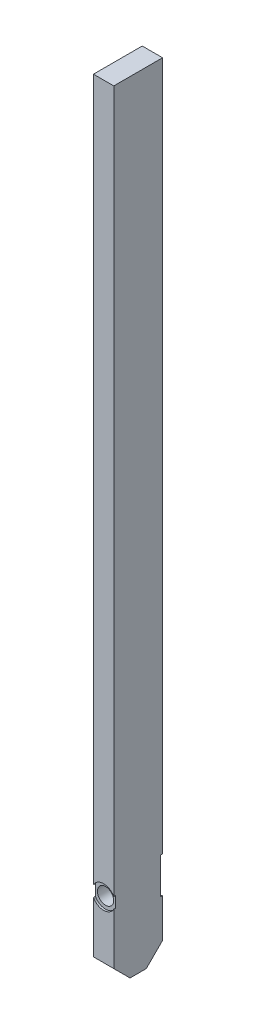
ISO-10303-21;
HEADER;
FILE_DESCRIPTION(('STEP AP214'),'2;1');
FILE_NAME('part.step','',(''),(''),'','','');
FILE_SCHEMA(('AUTOMOTIVE_DESIGN { 1 0 10303 214 1 1 1 1 }'));
ENDSEC;
DATA;
#1=APPLICATION_CONTEXT('core data for automotive mechanical design processes');
#2=APPLICATION_PROTOCOL_DEFINITION('international standard','automotive_design',2000,#1);
#3=PRODUCT_CONTEXT('',#1,'mechanical');
#4=PRODUCT('Part','Part','',(#3));
#5=PRODUCT_RELATED_PRODUCT_CATEGORY('part','',(#4));
#6=PRODUCT_DEFINITION_FORMATION('','',#4);
#7=PRODUCT_DEFINITION_CONTEXT('part definition',#1,'design');
#8=PRODUCT_DEFINITION('design','',#6,#7);
#9=PRODUCT_DEFINITION_SHAPE('','',#8);
#10=(LENGTH_UNIT() NAMED_UNIT(*) SI_UNIT(.MILLI.,.METRE.));
#11=(NAMED_UNIT(*) PLANE_ANGLE_UNIT() SI_UNIT($,.RADIAN.));
#12=(NAMED_UNIT(*) SI_UNIT($,.STERADIAN.) SOLID_ANGLE_UNIT());
#13=UNCERTAINTY_MEASURE_WITH_UNIT(LENGTH_MEASURE(1.E-05),#10,'distance_accuracy_value','');
#14=(GEOMETRIC_REPRESENTATION_CONTEXT(3) GLOBAL_UNCERTAINTY_ASSIGNED_CONTEXT((#13)) GLOBAL_UNIT_ASSIGNED_CONTEXT((#10,
#11,#12)) REPRESENTATION_CONTEXT('',''));
#15=CARTESIAN_POINT('',(0.,0.,0.));
#16=DIRECTION('',(0.,0.,1.));
#17=DIRECTION('',(1.,0.,0.));
#18=AXIS2_PLACEMENT_3D('',#15,#16,#17);
#19=CARTESIAN_POINT('',(15.875,304.8,19.05));
#20=DIRECTION('',(0.,0.,-1.));
#21=DIRECTION('',(0.,1.,0.));
#22=AXIS2_PLACEMENT_3D('',#19,#20,#21);
#23=PLANE('',#22);
#24=CARTESIAN_POINT('',(7.93749999999999,-247.65,19.05));
#25=DIRECTION('',(0.,0.,1.));
#26=DIRECTION('',(1.,0.,0.));
#27=AXIS2_PLACEMENT_3D('',#24,#25,#26);
#28=CIRCLE('',#27,9.01700000000001);
#29=CARTESIAN_POINT('',(15.875,-243.371871583274,19.05));
#30=VERTEX_POINT('',#29);
#31=CARTESIAN_POINT('',(0.,-243.371871583274,19.05));
#32=VERTEX_POINT('',#31);
#33=EDGE_CURVE('E150',#30,#32,#28,.T.);
#34=ORIENTED_EDGE('',*,*,#33,.F.);
#35=DIRECTION('',(0.,-1.,0.));
#36=VECTOR('',#35,1.);
#37=CARTESIAN_POINT('',(15.875,304.8,19.05));
#38=LINE('',#37,#36);
#39=CARTESIAN_POINT('',(15.875,304.8,19.05));
#40=VERTEX_POINT('',#39);
#41=EDGE_CURVE('E156',#40,#30,#38,.T.);
#42=ORIENTED_EDGE('',*,*,#41,.F.);
#43=DIRECTION('',(-1.,0.,0.));
#44=VECTOR('',#43,1.);
#45=CARTESIAN_POINT('',(15.875,304.8,19.05));
#46=LINE('',#45,#44);
#47=CARTESIAN_POINT('',(0.,304.8,19.05));
#48=VERTEX_POINT('',#47);
#49=EDGE_CURVE('E175',#40,#48,#46,.T.);
#50=ORIENTED_EDGE('',*,*,#49,.T.);
#51=DIRECTION('',(0.,-1.,0.));
#52=VECTOR('',#51,1.);
#53=CARTESIAN_POINT('',(0.,304.8,19.05));
#54=LINE('',#53,#52);
#55=EDGE_CURVE('E159',#48,#32,#54,.T.);
#56=ORIENTED_EDGE('',*,*,#55,.T.);
#57=EDGE_LOOP('',(#34,#42,#50,#56));
#58=FACE_BOUND('',#57,.T.);
#59=ADVANCED_FACE('F43',(#58),#23,.F.);
#60=CARTESIAN_POINT('',(0.,-251.928128416726,19.05));
#61=VERTEX_POINT('',#60);
#62=CARTESIAN_POINT('',(15.875,-251.928128416726,19.05));
#63=VERTEX_POINT('',#62);
#64=EDGE_CURVE('E162',#61,#63,#28,.T.);
#65=ORIENTED_EDGE('',*,*,#64,.F.);
#66=CARTESIAN_POINT('',(0.,-292.1,19.05));
#67=VERTEX_POINT('',#66);
#68=EDGE_CURVE('E182',#61,#67,#54,.T.);
#69=ORIENTED_EDGE('',*,*,#68,.T.);
#70=DIRECTION('',(1.,0.,0.));
#71=VECTOR('',#70,1.);
#72=CARTESIAN_POINT('',(15.875,-292.1,19.05));
#73=LINE('',#72,#71);
#74=CARTESIAN_POINT('',(15.875,-292.1,19.05));
#75=VERTEX_POINT('',#74);
#76=EDGE_CURVE('E211',#67,#75,#73,.T.);
#77=ORIENTED_EDGE('',*,*,#76,.T.);
#78=EDGE_CURVE('E169',#63,#75,#38,.T.);
#79=ORIENTED_EDGE('',*,*,#78,.F.);
#80=EDGE_LOOP('',(#65,#69,#77,#79));
#81=FACE_BOUND('',#80,.T.);
#82=ADVANCED_FACE('F241',(#81),#23,.F.);
#83=CARTESIAN_POINT('',(7.93749999999999,-247.65,-0.381000000000006));
#84=DIRECTION('',(0.,0.,1.));
#85=DIRECTION('',(1.,0.,0.));
#86=AXIS2_PLACEMENT_3D('',#83,#84,#85);
#87=CYLINDRICAL_SURFACE('',#86,6.35);
#88=CARTESIAN_POINT('',(7.93749999999999,-247.65,-0.381000000000006));
#89=DIRECTION('',(0.,0.,1.));
#90=DIRECTION('',(1.,0.,0.));
#91=AXIS2_PLACEMENT_3D('',#88,#89,#90);
#92=CIRCLE('',#91,6.35);
#93=CARTESIAN_POINT('',(14.2875,-247.65,-0.381000000000006));
#94=VERTEX_POINT('',#93);
#95=EDGE_CURVE('E200',#94,#94,#92,.T.);
#96=CARTESIAN_POINT('',(7.93749999999999,-247.65,17.526));
#97=DIRECTION('',(0.,0.,1.));
#98=DIRECTION('',(1.,0.,0.));
#99=AXIS2_PLACEMENT_3D('',#96,#97,#98);
#100=CIRCLE('',#99,6.35);
#101=CARTESIAN_POINT('',(14.2875,-247.65,17.526));
#102=VERTEX_POINT('',#101);
#103=EDGE_CURVE('E224',#102,#102,#100,.F.);
#104=CARTESIAN_POINT('',(14.2875,-247.65,-0.381000000000006));
#105=CARTESIAN_POINT('',(14.2875,-247.65,-0.194468750000007));
#106=CARTESIAN_POINT('',(14.2875,-247.65,-0.0079375000000065));
#107=CARTESIAN_POINT('',(14.2875,-247.65,0.365124999999994));
#108=CARTESIAN_POINT('',(14.2875,-247.65,0.551656249999993));
#109=CARTESIAN_POINT('',(14.2875,-247.65,0.924718749999993));
#110=CARTESIAN_POINT('',(14.2875,-247.65,1.11124999999999));
#111=CARTESIAN_POINT('',(14.2875,-247.65,1.48431249999999));
#112=CARTESIAN_POINT('',(14.2875,-247.65,1.67084374999999));
#113=CARTESIAN_POINT('',(14.2875,-247.65,2.04390624999999));
#114=CARTESIAN_POINT('',(14.2875,-247.65,2.23043749999999));
#115=CARTESIAN_POINT('',(14.2875,-247.65,2.60349999999999));
#116=CARTESIAN_POINT('',(14.2875,-247.65,2.79003124999999));
#117=CARTESIAN_POINT('',(14.2875,-247.65,3.16309374999999));
#118=CARTESIAN_POINT('',(14.2875,-247.65,3.34962499999999));
#119=CARTESIAN_POINT('',(14.2875,-247.65,3.72268749999999));
#120=CARTESIAN_POINT('',(14.2875,-247.65,3.90921874999999));
#121=CARTESIAN_POINT('',(14.2875,-247.65,4.28228124999999));
#122=CARTESIAN_POINT('',(14.2875,-247.65,4.46881249999999));
#123=CARTESIAN_POINT('',(14.2875,-247.65,4.84187499999999));
#124=CARTESIAN_POINT('',(14.2875,-247.65,5.02840624999999));
#125=CARTESIAN_POINT('',(14.2875,-247.65,5.40146874999999));
#126=CARTESIAN_POINT('',(14.2875,-247.65,5.58799999999999));
#127=CARTESIAN_POINT('',(14.2875,-247.65,5.96106249999999));
#128=CARTESIAN_POINT('',(14.2875,-247.65,6.14759374999999));
#129=CARTESIAN_POINT('',(14.2875,-247.65,6.52065624999999));
#130=CARTESIAN_POINT('',(14.2875,-247.65,6.70718749999999));
#131=CARTESIAN_POINT('',(14.2875,-247.65,7.08024999999999));
#132=CARTESIAN_POINT('',(14.2875,-247.65,7.26678124999999));
#133=CARTESIAN_POINT('',(14.2875,-247.65,7.63984374999999));
#134=CARTESIAN_POINT('',(14.2875,-247.65,7.82637499999999));
#135=CARTESIAN_POINT('',(14.2875,-247.65,8.19943749999999));
#136=CARTESIAN_POINT('',(14.2875,-247.65,8.38596874999999));
#137=CARTESIAN_POINT('',(14.2875,-247.65,8.75903124999999));
#138=CARTESIAN_POINT('',(14.2875,-247.65,8.94556249999999));
#139=CARTESIAN_POINT('',(14.2875,-247.65,9.31862499999999));
#140=CARTESIAN_POINT('',(14.2875,-247.65,9.50515624999999));
#141=CARTESIAN_POINT('',(14.2875,-247.65,9.87821874999999));
#142=CARTESIAN_POINT('',(14.2875,-247.65,10.06475));
#143=CARTESIAN_POINT('',(14.2875,-247.65,10.4378125));
#144=CARTESIAN_POINT('',(14.2875,-247.65,10.62434375));
#145=CARTESIAN_POINT('',(14.2875,-247.65,10.99740625));
#146=CARTESIAN_POINT('',(14.2875,-247.65,11.1839375));
#147=CARTESIAN_POINT('',(14.2875,-247.65,11.557));
#148=CARTESIAN_POINT('',(14.2875,-247.65,11.74353125));
#149=CARTESIAN_POINT('',(14.2875,-247.65,12.11659375));
#150=CARTESIAN_POINT('',(14.2875,-247.65,12.303125));
#151=CARTESIAN_POINT('',(14.2875,-247.65,12.6761875));
#152=CARTESIAN_POINT('',(14.2875,-247.65,12.86271875));
#153=CARTESIAN_POINT('',(14.2875,-247.65,13.23578125));
#154=CARTESIAN_POINT('',(14.2875,-247.65,13.4223125));
#155=CARTESIAN_POINT('',(14.2875,-247.65,13.795375));
#156=CARTESIAN_POINT('',(14.2875,-247.65,13.98190625));
#157=CARTESIAN_POINT('',(14.2875,-247.65,14.35496875));
#158=CARTESIAN_POINT('',(14.2875,-247.65,14.5415));
#159=CARTESIAN_POINT('',(14.2875,-247.65,14.9145625));
#160=CARTESIAN_POINT('',(14.2875,-247.65,15.10109375));
#161=CARTESIAN_POINT('',(14.2875,-247.65,15.47415625));
#162=CARTESIAN_POINT('',(14.2875,-247.65,15.6606875));
#163=CARTESIAN_POINT('',(14.2875,-247.65,16.03375));
#164=CARTESIAN_POINT('',(14.2875,-247.65,16.22028125));
#165=CARTESIAN_POINT('',(14.2875,-247.65,16.59334375));
#166=CARTESIAN_POINT('',(14.2875,-247.65,16.779875));
#167=CARTESIAN_POINT('',(14.2875,-247.65,17.1529375));
#168=CARTESIAN_POINT('',(14.2875,-247.65,17.33946875));
#169=CARTESIAN_POINT('',(14.2875,-247.65,17.526));
#170=B_SPLINE_CURVE_WITH_KNOTS('',3,(#104,#105,#106,#107,#108,#109,#110,#111,#112,#113,#114,
#115,#116,#117,#118,#119,#120,#121,#122,#123,#124,#125,#126,#127,#128,#129,#130,#131,#132,#133,
#134,#135,#136,#137,#138,#139,#140,#141,#142,#143,#144,#145,#146,#147,#148,#149,#150,#151,#152,
#153,#154,#155,#156,#157,#158,#159,#160,#161,#162,#163,#164,#165,#166,#167,#168,#169),
.UNSPECIFIED.,.F.,.F.,(4,2,2,2,2,2,2,2,2,2,2,2,2,2,2,2,2,2,2,2,2,2,2,2,2,2,2,2,2,2,2,2,4),(0.,
0.55959375,1.1191875,1.67878125,2.238375,2.79796875,3.3575625,3.91715625,4.47675,5.03634375,
5.5959375,6.15553125,6.715125,7.27471875,7.8343125,8.39390625,8.9535,9.51309375,10.0726875,
10.63228125,11.191875,11.75146875,12.3110625,12.87065625,13.43025,13.98984375,14.5494375,
15.10903125,15.668625,16.22821875,16.7878125,17.34740625,17.907),.UNSPECIFIED.);
#171=EDGE_CURVE('BSEAM325',#94,#102,#170,.T.);
#172=ORIENTED_EDGE('',*,*,#95,.F.);
#173=ORIENTED_EDGE('',*,*,#103,.F.);
#174=ORIENTED_EDGE('',*,*,#171,.T.);
#175=ORIENTED_EDGE('',*,*,#171,.F.);
#176=EDGE_LOOP('',(#172,#174,#173,#175));
#177=FACE_BOUND('',#176,.T.);
#178=ADVANCED_FACE('F325',(#177),#87,.F.);
#179=CARTESIAN_POINT('',(7.93749999999999,-247.65,-19.05));
#180=DIRECTION('',(0.,0.,1.));
#181=DIRECTION('',(1.,0.,0.));
#182=AXIS2_PLACEMENT_3D('',#179,#180,#181);
#183=CYLINDRICAL_SURFACE('',#182,4.7625);
#184=CARTESIAN_POINT('',(7.93749999999999,-247.65,-0.381000000000006));
#185=DIRECTION('',(0.,0.,1.));
#186=DIRECTION('',(1.,0.,0.));
#187=AXIS2_PLACEMENT_3D('',#184,#185,#186);
#188=CIRCLE('',#187,4.7625);
#189=CARTESIAN_POINT('',(12.7,-247.65,-0.381000000000006));
#190=VERTEX_POINT('',#189);
#191=EDGE_CURVE('E191',#190,#190,#188,.F.);
#192=ORIENTED_EDGE('',*,*,#191,.F.);
#193=EDGE_LOOP('',(#192));
#194=FACE_BOUND('',#193,.T.);
#195=CARTESIAN_POINT('',(7.93749999999999,-247.65,-17.272));
#196=DIRECTION('',(0.,0.,-1.));
#197=DIRECTION('',(0.,1.,0.));
#198=AXIS2_PLACEMENT_3D('',#195,#196,#197);
#199=CIRCLE('',#198,4.7625);
#200=CARTESIAN_POINT('',(7.93749999999999,-242.8875,-17.272));
#201=VERTEX_POINT('',#200);
#202=EDGE_CURVE('E263',#201,#201,#199,.F.);
#203=ORIENTED_EDGE('',*,*,#202,.F.);
#204=EDGE_LOOP('',(#203));
#205=FACE_BOUND('',#204,.T.);
#206=ADVANCED_FACE('F327',(#194,#205),#183,.F.);
#207=CARTESIAN_POINT('',(15.875,304.8,-19.05));
#208=DIRECTION('',(0.,0.,1.));
#209=DIRECTION('',(0.,-1.,0.));
#210=AXIS2_PLACEMENT_3D('',#207,#208,#209);
#211=PLANE('',#210);
#212=CARTESIAN_POINT('',(7.93749999999999,-247.65,-19.05));
#213=DIRECTION('',(0.,0.,-1.));
#214=DIRECTION('',(0.,1.,0.));
#215=AXIS2_PLACEMENT_3D('',#212,#213,#214);
#216=CIRCLE('',#215,16.1925);
#217=CARTESIAN_POINT('',(15.875,-261.763580339517,-19.05));
#218=VERTEX_POINT('',#217);
#219=CARTESIAN_POINT('',(0.,-261.763580339517,-19.05));
#220=VERTEX_POINT('',#219);
#221=EDGE_CURVE('E257',#218,#220,#216,.T.);
#222=ORIENTED_EDGE('',*,*,#221,.F.);
#223=DIRECTION('',(0.,1.,0.));
#224=VECTOR('',#223,1.);
#225=CARTESIAN_POINT('',(15.875,304.8,-19.05));
#226=LINE('',#225,#224);
#227=CARTESIAN_POINT('',(15.875,-292.1,-19.05));
#228=VERTEX_POINT('',#227);
#229=EDGE_CURVE('E267',#228,#218,#226,.T.);
#230=ORIENTED_EDGE('',*,*,#229,.F.);
#231=DIRECTION('',(-1.,0.,0.));
#232=VECTOR('',#231,1.);
#233=CARTESIAN_POINT('',(15.875,-292.1,-19.05));
#234=LINE('',#233,#232);
#235=CARTESIAN_POINT('',(0.,-292.1,-19.05));
#236=VERTEX_POINT('',#235);
#237=EDGE_CURVE('E194',#228,#236,#234,.T.);
#238=ORIENTED_EDGE('',*,*,#237,.T.);
#239=DIRECTION('',(0.,1.,0.));
#240=VECTOR('',#239,1.);
#241=CARTESIAN_POINT('',(0.,304.8,-19.05));
#242=LINE('',#241,#240);
#243=EDGE_CURVE('E180',#236,#220,#242,.T.);
#244=ORIENTED_EDGE('',*,*,#243,.T.);
#245=EDGE_LOOP('',(#222,#230,#238,#244));
#246=FACE_BOUND('',#245,.T.);
#247=ADVANCED_FACE('F291',(#246),#211,.F.);
#248=CARTESIAN_POINT('',(0.,-233.536419660483,-19.05));
#249=VERTEX_POINT('',#248);
#250=CARTESIAN_POINT('',(15.875,-233.536419660483,-19.05));
#251=VERTEX_POINT('',#250);
#252=EDGE_CURVE('E153',#249,#251,#216,.T.);
#253=ORIENTED_EDGE('',*,*,#252,.F.);
#254=CARTESIAN_POINT('',(0.,304.8,-19.05));
#255=VERTEX_POINT('',#254);
#256=EDGE_CURVE('E181',#249,#255,#242,.T.);
#257=ORIENTED_EDGE('',*,*,#256,.T.);
#258=DIRECTION('',(-1.,0.,0.));
#259=VECTOR('',#258,1.);
#260=CARTESIAN_POINT('',(15.875,304.8,-19.05));
#261=LINE('',#260,#259);
#262=CARTESIAN_POINT('',(15.875,304.8,-19.05));
#263=VERTEX_POINT('',#262);
#264=EDGE_CURVE('E188',#263,#255,#261,.T.);
#265=ORIENTED_EDGE('',*,*,#264,.F.);
#266=EDGE_CURVE('E189',#251,#263,#226,.T.);
#267=ORIENTED_EDGE('',*,*,#266,.F.);
#268=EDGE_LOOP('',(#253,#257,#265,#267));
#269=FACE_BOUND('',#268,.T.);
#270=ADVANCED_FACE('F278',(#269),#211,.F.);
#271=CARTESIAN_POINT('',(15.875,304.8,19.05));
#272=DIRECTION('',(0.,-1.,0.));
#273=DIRECTION('',(0.,0.,-1.));
#274=AXIS2_PLACEMENT_3D('',#271,#272,#273);
#275=PLANE('',#274);
#276=DIRECTION('',(0.,0.,1.));
#277=VECTOR('',#276,1.);
#278=CARTESIAN_POINT('',(0.,304.8,19.05));
#279=LINE('',#278,#277);
#280=EDGE_CURVE('E179',#255,#48,#279,.T.);
#281=ORIENTED_EDGE('',*,*,#280,.T.);
#282=ORIENTED_EDGE('',*,*,#49,.F.);
#283=DIRECTION('',(0.,0.,1.));
#284=VECTOR('',#283,1.);
#285=CARTESIAN_POINT('',(15.875,304.8,19.05));
#286=LINE('',#285,#284);
#287=EDGE_CURVE('E168',#263,#40,#286,.T.);
#288=ORIENTED_EDGE('',*,*,#287,.F.);
#289=ORIENTED_EDGE('',*,*,#264,.T.);
#290=EDGE_LOOP('',(#281,#282,#288,#289));
#291=FACE_BOUND('',#290,.T.);
#292=ADVANCED_FACE('F276',(#291),#275,.F.);
#293=CARTESIAN_POINT('',(15.875,-304.8,19.05));
#294=DIRECTION('',(0.,1.,0.));
#295=DIRECTION('',(0.,0.,1.));
#296=AXIS2_PLACEMENT_3D('',#293,#294,#295);
#297=PLANE('',#296);
#298=DIRECTION('',(0.,0.,-1.));
#299=VECTOR('',#298,1.);
#300=CARTESIAN_POINT('',(0.,-304.8,19.05));
#301=LINE('',#300,#299);
#302=CARTESIAN_POINT('',(0.,-304.8,6.34999999999992));
#303=VERTEX_POINT('',#302);
#304=CARTESIAN_POINT('',(0.,-304.8,-6.35000000000005));
#305=VERTEX_POINT('',#304);
#306=EDGE_CURVE('E184',#303,#305,#301,.T.);
#307=ORIENTED_EDGE('',*,*,#306,.T.);
#308=DIRECTION('',(1.,0.,0.));
#309=VECTOR('',#308,1.);
#310=CARTESIAN_POINT('',(15.875,-304.8,-6.35000000000006));
#311=LINE('',#310,#309);
#312=CARTESIAN_POINT('',(15.875,-304.8,-6.35000000000005));
#313=VERTEX_POINT('',#312);
#314=EDGE_CURVE('E206',#305,#313,#311,.T.);
#315=ORIENTED_EDGE('',*,*,#314,.T.);
#316=DIRECTION('',(0.,0.,-1.));
#317=VECTOR('',#316,1.);
#318=CARTESIAN_POINT('',(15.875,-304.8,19.05));
#319=LINE('',#318,#317);
#320=CARTESIAN_POINT('',(15.875,-304.8,6.34999999999992));
#321=VERTEX_POINT('',#320);
#322=EDGE_CURVE('E166',#321,#313,#319,.T.);
#323=ORIENTED_EDGE('',*,*,#322,.F.);
#324=DIRECTION('',(-1.,0.,0.));
#325=VECTOR('',#324,1.);
#326=CARTESIAN_POINT('',(15.875,-304.8,6.34999999999991));
#327=LINE('',#326,#325);
#328=EDGE_CURVE('E204',#321,#303,#327,.T.);
#329=ORIENTED_EDGE('',*,*,#328,.T.);
#330=EDGE_LOOP('',(#307,#315,#323,#329));
#331=FACE_BOUND('',#330,.T.);
#332=ADVANCED_FACE('F297',(#331),#297,.F.);
#333=CARTESIAN_POINT('',(15.875,0.,0.));
#334=DIRECTION('',(1.,0.,0.));
#335=DIRECTION('',(0.,0.,-1.));
#336=AXIS2_PLACEMENT_3D('',#333,#334,#335);
#337=PLANE('',#336);
#338=DIRECTION('',(0.,0.,1.));
#339=VECTOR('',#338,1.);
#340=CARTESIAN_POINT('',(15.875,-243.371871583274,17.526));
#341=LINE('',#340,#339);
#342=CARTESIAN_POINT('',(15.875,-243.371871583274,17.526));
#343=VERTEX_POINT('',#342);
#344=EDGE_CURVE('E144',#343,#30,#341,.T.);
#345=ORIENTED_EDGE('',*,*,#344,.F.);
#346=DIRECTION('',(0.,-1.,0.));
#347=VECTOR('',#346,1.);
#348=CARTESIAN_POINT('',(15.875,0.,17.526));
#349=LINE('',#348,#347);
#350=CARTESIAN_POINT('',(15.875,-251.928128416726,17.526));
#351=VERTEX_POINT('',#350);
#352=EDGE_CURVE('E249',#343,#351,#349,.T.);
#353=ORIENTED_EDGE('',*,*,#352,.T.);
#354=DIRECTION('',(0.,0.,1.));
#355=VECTOR('',#354,1.);
#356=CARTESIAN_POINT('',(15.875,-251.928128416726,17.526));
#357=LINE('',#356,#355);
#358=EDGE_CURVE('E155',#63,#351,#357,.F.);
#359=ORIENTED_EDGE('',*,*,#358,.F.);
#360=ORIENTED_EDGE('',*,*,#78,.T.);
#361=DIRECTION('',(0.,0.707106781186551,0.707106781186544));
#362=VECTOR('',#361,1.);
#363=CARTESIAN_POINT('',(15.875,-155.574999999999,155.575));
#364=LINE('',#363,#362);
#365=EDGE_CURVE('E208',#75,#321,#364,.F.);
#366=ORIENTED_EDGE('',*,*,#365,.T.);
#367=ORIENTED_EDGE('',*,*,#322,.T.);
#368=DIRECTION('',(0.,-0.707106781186543,0.707106781186552));
#369=VECTOR('',#368,1.);
#370=CARTESIAN_POINT('',(15.875,-155.575000000002,-155.575));
#371=LINE('',#370,#369);
#372=EDGE_CURVE('E215',#313,#228,#371,.F.);
#373=ORIENTED_EDGE('',*,*,#372,.T.);
#374=ORIENTED_EDGE('',*,*,#229,.T.);
#375=DIRECTION('',(0.,0.,-1.));
#376=VECTOR('',#375,1.);
#377=CARTESIAN_POINT('',(15.875,-261.763580339517,-17.272));
#378=LINE('',#377,#376);
#379=CARTESIAN_POINT('',(15.875,-261.763580339517,-17.272));
#380=VERTEX_POINT('',#379);
#381=EDGE_CURVE('E268',#380,#218,#378,.T.);
#382=ORIENTED_EDGE('',*,*,#381,.F.);
#383=DIRECTION('',(0.,1.,0.));
#384=VECTOR('',#383,1.);
#385=CARTESIAN_POINT('',(15.875,0.,-17.272));
#386=LINE('',#385,#384);
#387=CARTESIAN_POINT('',(15.875,-233.536419660483,-17.272));
#388=VERTEX_POINT('',#387);
#389=EDGE_CURVE('E259',#380,#388,#386,.T.);
#390=ORIENTED_EDGE('',*,*,#389,.T.);
#391=DIRECTION('',(0.,0.,-1.));
#392=VECTOR('',#391,1.);
#393=CARTESIAN_POINT('',(15.875,-233.536419660483,-17.272));
#394=LINE('',#393,#392);
#395=EDGE_CURVE('E262',#251,#388,#394,.F.);
#396=ORIENTED_EDGE('',*,*,#395,.F.);
#397=ORIENTED_EDGE('',*,*,#266,.T.);
#398=ORIENTED_EDGE('',*,*,#287,.T.);
#399=ORIENTED_EDGE('',*,*,#41,.T.);
#400=EDGE_LOOP('',(#345,#353,#359,#360,#366,#367,#373,#374,#382,#390,#396,#397,#398,#399));
#401=FACE_BOUND('',#400,.T.);
#402=ADVANCED_FACE('F165',(#401),#337,.T.);
#403=CARTESIAN_POINT('',(0.,0.,0.));
#404=DIRECTION('',(1.,0.,0.));
#405=DIRECTION('',(0.,0.,-1.));
#406=AXIS2_PLACEMENT_3D('',#403,#404,#405);
#407=PLANE('',#406);
#408=DIRECTION('',(0.,-1.,0.));
#409=VECTOR('',#408,1.);
#410=CARTESIAN_POINT('',(0.,0.,17.526));
#411=LINE('',#410,#409);
#412=CARTESIAN_POINT('',(0.,-243.371871583274,17.526));
#413=VERTEX_POINT('',#412);
#414=CARTESIAN_POINT('',(0.,-251.928128416726,17.526));
#415=VERTEX_POINT('',#414);
#416=EDGE_CURVE('E227',#413,#415,#411,.T.);
#417=ORIENTED_EDGE('',*,*,#416,.F.);
#418=DIRECTION('',(0.,0.,1.));
#419=VECTOR('',#418,1.);
#420=CARTESIAN_POINT('',(0.,-243.371871583274,17.526));
#421=LINE('',#420,#419);
#422=EDGE_CURVE('E11',#413,#32,#421,.T.);
#423=ORIENTED_EDGE('',*,*,#422,.T.);
#424=ORIENTED_EDGE('',*,*,#55,.F.);
#425=ORIENTED_EDGE('',*,*,#280,.F.);
#426=ORIENTED_EDGE('',*,*,#256,.F.);
#427=DIRECTION('',(0.,0.,-1.));
#428=VECTOR('',#427,1.);
#429=CARTESIAN_POINT('',(0.,-233.536419660483,-17.272));
#430=LINE('',#429,#428);
#431=CARTESIAN_POINT('',(0.,-233.536419660483,-17.272));
#432=VERTEX_POINT('',#431);
#433=EDGE_CURVE('E217',#249,#432,#430,.F.);
#434=ORIENTED_EDGE('',*,*,#433,.T.);
#435=DIRECTION('',(0.,1.,0.));
#436=VECTOR('',#435,1.);
#437=CARTESIAN_POINT('',(0.,0.,-17.272));
#438=LINE('',#437,#436);
#439=CARTESIAN_POINT('',(0.,-261.763580339517,-17.272));
#440=VERTEX_POINT('',#439);
#441=EDGE_CURVE('E220',#440,#432,#438,.T.);
#442=ORIENTED_EDGE('',*,*,#441,.F.);
#443=DIRECTION('',(0.,0.,-1.));
#444=VECTOR('',#443,1.);
#445=CARTESIAN_POINT('',(0.,-261.763580339517,-17.272));
#446=LINE('',#445,#444);
#447=EDGE_CURVE('E225',#440,#220,#446,.T.);
#448=ORIENTED_EDGE('',*,*,#447,.T.);
#449=ORIENTED_EDGE('',*,*,#243,.F.);
#450=DIRECTION('',(0.,0.707106781186543,-0.707106781186552));
#451=VECTOR('',#450,1.);
#452=CARTESIAN_POINT('',(0.,-292.1,-19.05));
#453=LINE('',#452,#451);
#454=EDGE_CURVE('E201',#236,#305,#453,.F.);
#455=ORIENTED_EDGE('',*,*,#454,.T.);
#456=ORIENTED_EDGE('',*,*,#306,.F.);
#457=DIRECTION('',(0.,-0.707106781186551,-0.707106781186544));
#458=VECTOR('',#457,1.);
#459=CARTESIAN_POINT('',(0.,-304.8,6.34999999999991));
#460=LINE('',#459,#458);
#461=EDGE_CURVE('E199',#303,#67,#460,.F.);
#462=ORIENTED_EDGE('',*,*,#461,.T.);
#463=ORIENTED_EDGE('',*,*,#68,.F.);
#464=DIRECTION('',(0.,0.,1.));
#465=VECTOR('',#464,1.);
#466=CARTESIAN_POINT('',(0.,-251.928128416726,17.526));
#467=LINE('',#466,#465);
#468=EDGE_CURVE('E55',#61,#415,#467,.F.);
#469=ORIENTED_EDGE('',*,*,#468,.T.);
#470=EDGE_LOOP('',(#417,#423,#424,#425,#426,#434,#442,#448,#449,#455,#456,#462,#463,#469));
#471=FACE_BOUND('',#470,.T.);
#472=ADVANCED_FACE('F235',(#471),#407,.F.);
#473=CARTESIAN_POINT('',(7.93749999999999,-247.65,-0.381000000000006));
#474=DIRECTION('',(0.,0.,1.));
#475=DIRECTION('',(1.,0.,0.));
#476=AXIS2_PLACEMENT_3D('',#473,#474,#475);
#477=PLANE('',#476);
#478=ORIENTED_EDGE('',*,*,#95,.T.);
#479=EDGE_LOOP('',(#478));
#480=FACE_BOUND('',#479,.T.);
#481=ORIENTED_EDGE('',*,*,#191,.T.);
#482=EDGE_LOOP('',(#481));
#483=FACE_BOUND('',#482,.T.);
#484=ADVANCED_FACE('F314',(#480,#483),#477,.T.);
#485=CARTESIAN_POINT('',(15.875,-292.1,-19.05));
#486=DIRECTION('',(0.,0.707106781186552,0.707106781186543));
#487=DIRECTION('',(-1.,0.,0.));
#488=AXIS2_PLACEMENT_3D('',#485,#486,#487);
#489=PLANE('',#488);
#490=ORIENTED_EDGE('',*,*,#372,.F.);
#491=ORIENTED_EDGE('',*,*,#314,.F.);
#492=ORIENTED_EDGE('',*,*,#454,.F.);
#493=ORIENTED_EDGE('',*,*,#237,.F.);
#494=EDGE_LOOP('',(#490,#491,#492,#493));
#495=FACE_BOUND('',#494,.T.);
#496=ADVANCED_FACE('F302',(#495),#489,.F.);
#497=CARTESIAN_POINT('',(15.875,-304.8,6.34999999999991));
#498=DIRECTION('',(0.,0.707106781186544,-0.707106781186551));
#499=DIRECTION('',(-1.,0.,0.));
#500=AXIS2_PLACEMENT_3D('',#497,#498,#499);
#501=PLANE('',#500);
#502=ORIENTED_EDGE('',*,*,#365,.F.);
#503=ORIENTED_EDGE('',*,*,#76,.F.);
#504=ORIENTED_EDGE('',*,*,#461,.F.);
#505=ORIENTED_EDGE('',*,*,#328,.F.);
#506=EDGE_LOOP('',(#502,#503,#504,#505));
#507=FACE_BOUND('',#506,.T.);
#508=ADVANCED_FACE('F46',(#507),#501,.F.);
#509=CARTESIAN_POINT('',(7.93749999999999,-247.65,-17.272));
#510=DIRECTION('',(0.,0.,-1.));
#511=DIRECTION('',(0.,1.,0.));
#512=AXIS2_PLACEMENT_3D('',#509,#510,#511);
#513=CYLINDRICAL_SURFACE('',#512,16.1925);
#514=ORIENTED_EDGE('',*,*,#381,.T.);
#515=ORIENTED_EDGE('',*,*,#221,.T.);
#516=ORIENTED_EDGE('',*,*,#447,.F.);
#517=CARTESIAN_POINT('',(7.93749999999999,-247.65,-17.272));
#518=DIRECTION('',(0.,0.,-1.));
#519=DIRECTION('',(0.,1.,0.));
#520=AXIS2_PLACEMENT_3D('',#517,#518,#519);
#521=CIRCLE('',#520,16.1925);
#522=EDGE_CURVE('E70',#380,#440,#521,.T.);
#523=ORIENTED_EDGE('',*,*,#522,.F.);
#524=EDGE_LOOP('',(#514,#515,#516,#523));
#525=FACE_BOUND('',#524,.T.);
#526=ADVANCED_FACE('F293',(#525),#513,.F.);
#527=ORIENTED_EDGE('',*,*,#395,.T.);
#528=EDGE_CURVE('E254',#432,#388,#521,.T.);
#529=ORIENTED_EDGE('',*,*,#528,.F.);
#530=ORIENTED_EDGE('',*,*,#433,.F.);
#531=ORIENTED_EDGE('',*,*,#252,.T.);
#532=EDGE_LOOP('',(#527,#529,#530,#531));
#533=FACE_BOUND('',#532,.T.);
#534=ADVANCED_FACE('F288',(#533),#513,.F.);
#535=CARTESIAN_POINT('',(7.93749999999999,-247.65,-17.272));
#536=DIRECTION('',(0.,0.,-1.));
#537=DIRECTION('',(0.,1.,0.));
#538=AXIS2_PLACEMENT_3D('',#535,#536,#537);
#539=PLANE('',#538);
#540=CARTESIAN_POINT('',(7.93749999999999,-235.331,-17.272));
#541=DIRECTION('',(0.,0.,-1.));
#542=DIRECTION('',(0.,1.,0.));
#543=AXIS2_PLACEMENT_3D('',#540,#541,#542);
#544=CIRCLE('',#543,0.762000000000008);
#545=CARTESIAN_POINT('',(7.93749999999999,-234.569,-17.272));
#546=VERTEX_POINT('',#545);
#547=EDGE_CURVE('E242',#546,#546,#544,.T.);
#548=ORIENTED_EDGE('',*,*,#547,.F.);
#549=EDGE_LOOP('',(#548));
#550=FACE_BOUND('',#549,.T.);
#551=ORIENTED_EDGE('',*,*,#522,.T.);
#552=ORIENTED_EDGE('',*,*,#441,.T.);
#553=ORIENTED_EDGE('',*,*,#528,.T.);
#554=ORIENTED_EDGE('',*,*,#389,.F.);
#555=EDGE_LOOP('',(#551,#552,#553,#554));
#556=FACE_BOUND('',#555,.T.);
#557=ORIENTED_EDGE('',*,*,#202,.T.);
#558=EDGE_LOOP('',(#557));
#559=FACE_BOUND('',#558,.T.);
#560=ADVANCED_FACE('F290',(#550,#556,#559),#539,.T.);
#561=CARTESIAN_POINT('',(7.93749999999999,-247.65,17.526));
#562=DIRECTION('',(0.,0.,1.));
#563=DIRECTION('',(1.,0.,0.));
#564=AXIS2_PLACEMENT_3D('',#561,#562,#563);
#565=CYLINDRICAL_SURFACE('',#564,9.01700000000001);
#566=ORIENTED_EDGE('',*,*,#344,.T.);
#567=ORIENTED_EDGE('',*,*,#33,.T.);
#568=ORIENTED_EDGE('',*,*,#422,.F.);
#569=CARTESIAN_POINT('',(7.93749999999999,-247.65,17.526));
#570=DIRECTION('',(0.,0.,1.));
#571=DIRECTION('',(1.,0.,0.));
#572=AXIS2_PLACEMENT_3D('',#569,#570,#571);
#573=CIRCLE('',#572,9.01700000000001);
#574=EDGE_CURVE('E56',#343,#413,#573,.T.);
#575=ORIENTED_EDGE('',*,*,#574,.F.);
#576=EDGE_LOOP('',(#566,#567,#568,#575));
#577=FACE_BOUND('',#576,.T.);
#578=ADVANCED_FACE('F147',(#577),#565,.F.);
#579=ORIENTED_EDGE('',*,*,#358,.T.);
#580=EDGE_CURVE('E163',#415,#351,#573,.T.);
#581=ORIENTED_EDGE('',*,*,#580,.F.);
#582=ORIENTED_EDGE('',*,*,#468,.F.);
#583=ORIENTED_EDGE('',*,*,#64,.T.);
#584=EDGE_LOOP('',(#579,#581,#582,#583));
#585=FACE_BOUND('',#584,.T.);
#586=ADVANCED_FACE('F236',(#585),#565,.F.);
#587=CARTESIAN_POINT('',(7.93749999999999,-247.65,17.526));
#588=DIRECTION('',(0.,0.,1.));
#589=DIRECTION('',(1.,0.,0.));
#590=AXIS2_PLACEMENT_3D('',#587,#588,#589);
#591=PLANE('',#590);
#592=ORIENTED_EDGE('',*,*,#103,.T.);
#593=EDGE_LOOP('',(#592));
#594=FACE_BOUND('',#593,.T.);
#595=ORIENTED_EDGE('',*,*,#574,.T.);
#596=ORIENTED_EDGE('',*,*,#416,.T.);
#597=ORIENTED_EDGE('',*,*,#580,.T.);
#598=ORIENTED_EDGE('',*,*,#352,.F.);
#599=EDGE_LOOP('',(#595,#596,#597,#598));
#600=FACE_BOUND('',#599,.T.);
#601=ADVANCED_FACE('F362',(#594,#600),#591,.T.);
#602=CARTESIAN_POINT('',(7.93749999999999,-235.331,-4.57200000000003));
#603=DIRECTION('',(0.,0.,-1.));
#604=DIRECTION('',(0.,1.,0.));
#605=AXIS2_PLACEMENT_3D('',#602,#603,#604);
#606=CYLINDRICAL_SURFACE('',#605,0.762000000000008);
#607=CARTESIAN_POINT('',(7.93749999999999,-235.331,-4.57200000000003));
#608=DIRECTION('',(0.,0.,-1.));
#609=DIRECTION('',(0.,1.,0.));
#610=AXIS2_PLACEMENT_3D('',#607,#608,#609);
#611=CIRCLE('',#610,0.762000000000008);
#612=CARTESIAN_POINT('',(7.93749999999999,-234.569,-4.57200000000003));
#613=VERTEX_POINT('',#612);
#614=EDGE_CURVE('E245',#613,#613,#611,.T.);
#615=ORIENTED_EDGE('',*,*,#614,.F.);
#616=EDGE_LOOP('',(#615));
#617=FACE_BOUND('',#616,.T.);
#618=ORIENTED_EDGE('',*,*,#547,.T.);
#619=EDGE_LOOP('',(#618));
#620=FACE_BOUND('',#619,.T.);
#621=ADVANCED_FACE('F368',(#617,#620),#606,.F.);
#622=CARTESIAN_POINT('',(7.93749999999999,-235.331,-4.57200000000003));
#623=DIRECTION('',(0.,0.,-1.));
#624=DIRECTION('',(0.,1.,0.));
#625=AXIS2_PLACEMENT_3D('',#622,#623,#624);
#626=PLANE('',#625);
#627=ORIENTED_EDGE('',*,*,#614,.T.);
#628=EDGE_LOOP('',(#627));
#629=FACE_BOUND('',#628,.T.);
#630=ADVANCED_FACE('F375',(#629),#626,.T.);
#631=CLOSED_SHELL('',(#59,#82,#178,#206,#247,#270,#292,#332,#402,#472,#484,#496,#508,#526,#534,
#560,#578,#586,#601,#621,#630));
#632=MANIFOLD_SOLID_BREP('B2',#631);
#633=ADVANCED_BREP_SHAPE_REPRESENTATION('',(#18,#632),#14);
#634=SHAPE_DEFINITION_REPRESENTATION(#9,#633);
ENDSEC;
END-ISO-10303-21;
